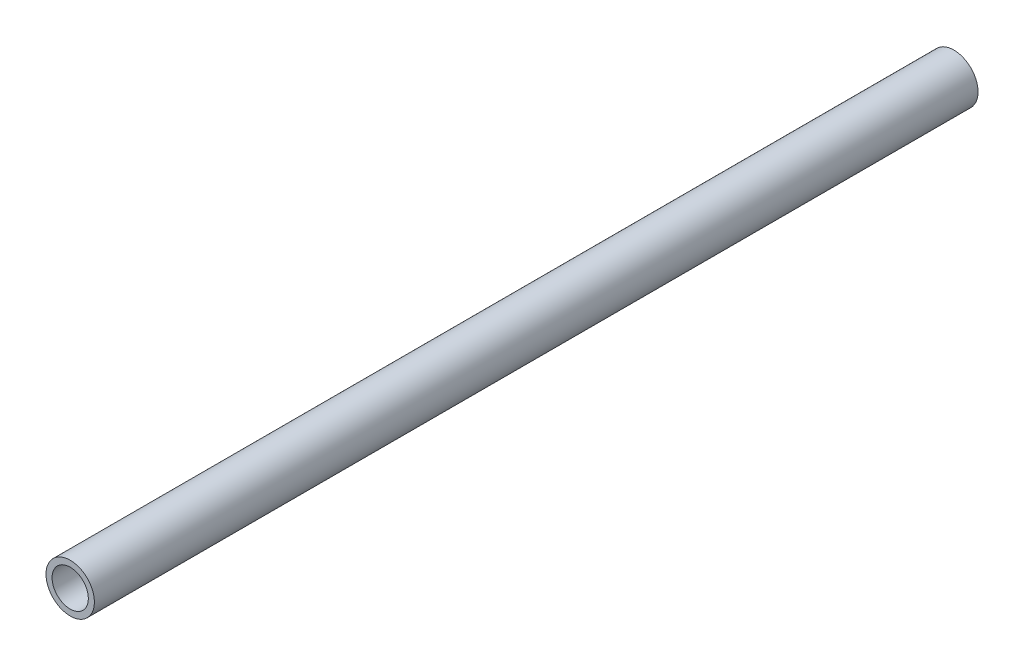
ISO-10303-21;
HEADER;
FILE_DESCRIPTION(('STEP AP214'),'2;1');
FILE_NAME('part.step','',(''),(''),'','','');
FILE_SCHEMA(('AUTOMOTIVE_DESIGN { 1 0 10303 214 1 1 1 1 }'));
ENDSEC;
DATA;
#1=APPLICATION_CONTEXT('core data for automotive mechanical design processes');
#2=APPLICATION_PROTOCOL_DEFINITION('international standard','automotive_design',2000,#1);
#3=PRODUCT_CONTEXT('',#1,'mechanical');
#4=PRODUCT('Part','Part','',(#3));
#5=PRODUCT_RELATED_PRODUCT_CATEGORY('part','',(#4));
#6=PRODUCT_DEFINITION_FORMATION('','',#4);
#7=PRODUCT_DEFINITION_CONTEXT('part definition',#1,'design');
#8=PRODUCT_DEFINITION('design','',#6,#7);
#9=PRODUCT_DEFINITION_SHAPE('','',#8);
#10=(LENGTH_UNIT() NAMED_UNIT(*) SI_UNIT(.MILLI.,.METRE.));
#11=(NAMED_UNIT(*) PLANE_ANGLE_UNIT() SI_UNIT($,.RADIAN.));
#12=(NAMED_UNIT(*) SI_UNIT($,.STERADIAN.) SOLID_ANGLE_UNIT());
#13=UNCERTAINTY_MEASURE_WITH_UNIT(LENGTH_MEASURE(1.E-05),#10,'distance_accuracy_value','');
#14=(GEOMETRIC_REPRESENTATION_CONTEXT(3) GLOBAL_UNCERTAINTY_ASSIGNED_CONTEXT((#13)) GLOBAL_UNIT_ASSIGNED_CONTEXT((#10,
#11,#12)) REPRESENTATION_CONTEXT('',''));
#15=CARTESIAN_POINT('',(0.,0.,0.));
#16=DIRECTION('',(0.,0.,1.));
#17=DIRECTION('',(1.,0.,0.));
#18=AXIS2_PLACEMENT_3D('',#15,#16,#17);
#19=CARTESIAN_POINT('',(0.,0.,232.));
#20=DIRECTION('',(0.,0.,1.));
#21=DIRECTION('',(1.,0.,0.));
#22=AXIS2_PLACEMENT_3D('',#19,#20,#21);
#23=PLANE('',#22);
#24=CARTESIAN_POINT('',(0.,0.,232.));
#25=DIRECTION('',(0.,0.,1.));
#26=DIRECTION('',(1.,0.,0.));
#27=AXIS2_PLACEMENT_3D('',#24,#25,#26);
#28=CIRCLE('',#27,6.35);
#29=CARTESIAN_POINT('',(-6.35,0.,232.));
#30=VERTEX_POINT('',#29);
#31=EDGE_CURVE('E10',#30,#30,#28,.T.);
#32=ORIENTED_EDGE('',*,*,#31,.T.);
#33=EDGE_LOOP('',(#32));
#34=FACE_BOUND('',#33,.T.);
#35=CARTESIAN_POINT('',(0.,0.,232.));
#36=DIRECTION('',(0.,0.,1.));
#37=DIRECTION('',(1.,0.,0.));
#38=AXIS2_PLACEMENT_3D('',#35,#36,#37);
#39=CIRCLE('',#38,4.7625);
#40=CARTESIAN_POINT('',(-4.7625,0.,232.));
#41=VERTEX_POINT('',#40);
#42=EDGE_CURVE('E50',#41,#41,#39,.T.);
#43=ORIENTED_EDGE('',*,*,#42,.F.);
#44=EDGE_LOOP('',(#43));
#45=FACE_BOUND('',#44,.T.);
#46=ADVANCED_FACE('F37',(#34,#45),#23,.T.);
#47=CARTESIAN_POINT('',(0.,0.,0.));
#48=DIRECTION('',(0.,0.,1.));
#49=DIRECTION('',(1.,0.,0.));
#50=AXIS2_PLACEMENT_3D('',#47,#48,#49);
#51=PLANE('',#50);
#52=CARTESIAN_POINT('',(0.,0.,0.));
#53=DIRECTION('',(0.,0.,1.));
#54=DIRECTION('',(1.,0.,0.));
#55=AXIS2_PLACEMENT_3D('',#52,#53,#54);
#56=CIRCLE('',#55,6.35);
#57=CARTESIAN_POINT('',(-6.35,0.,0.));
#58=VERTEX_POINT('',#57);
#59=EDGE_CURVE('E41',#58,#58,#56,.T.);
#60=ORIENTED_EDGE('',*,*,#59,.F.);
#61=EDGE_LOOP('',(#60));
#62=FACE_BOUND('',#61,.T.);
#63=CARTESIAN_POINT('',(0.,0.,0.));
#64=DIRECTION('',(0.,0.,1.));
#65=DIRECTION('',(1.,0.,0.));
#66=AXIS2_PLACEMENT_3D('',#63,#64,#65);
#67=CIRCLE('',#66,4.7625);
#68=CARTESIAN_POINT('',(-4.7625,0.,0.));
#69=VERTEX_POINT('',#68);
#70=EDGE_CURVE('E52',#69,#69,#67,.T.);
#71=ORIENTED_EDGE('',*,*,#70,.T.);
#72=EDGE_LOOP('',(#71));
#73=FACE_BOUND('',#72,.T.);
#74=ADVANCED_FACE('F64',(#62,#73),#51,.F.);
#75=CARTESIAN_POINT('',(0.,0.,232.));
#76=DIRECTION('',(0.,0.,-1.));
#77=DIRECTION('',(-1.,0.,0.));
#78=AXIS2_PLACEMENT_3D('',#75,#76,#77);
#79=CYLINDRICAL_SURFACE('',#78,6.35);
#80=CARTESIAN_POINT('',(-6.35,0.,232.));
#81=CARTESIAN_POINT('',(-6.35,0.,229.583333333333));
#82=CARTESIAN_POINT('',(-6.35,0.,227.166666666667));
#83=CARTESIAN_POINT('',(-6.35,0.,222.333333333333));
#84=CARTESIAN_POINT('',(-6.35,0.,219.916666666667));
#85=CARTESIAN_POINT('',(-6.35,0.,215.083333333333));
#86=CARTESIAN_POINT('',(-6.35,0.,212.666666666667));
#87=CARTESIAN_POINT('',(-6.35,0.,207.833333333333));
#88=CARTESIAN_POINT('',(-6.35,0.,205.416666666667));
#89=CARTESIAN_POINT('',(-6.35,0.,200.583333333333));
#90=CARTESIAN_POINT('',(-6.35,0.,198.166666666667));
#91=CARTESIAN_POINT('',(-6.35,0.,193.333333333333));
#92=CARTESIAN_POINT('',(-6.35,0.,190.916666666667));
#93=CARTESIAN_POINT('',(-6.35,0.,186.083333333333));
#94=CARTESIAN_POINT('',(-6.35,0.,183.666666666667));
#95=CARTESIAN_POINT('',(-6.35,0.,178.833333333333));
#96=CARTESIAN_POINT('',(-6.35,0.,176.416666666667));
#97=CARTESIAN_POINT('',(-6.35,0.,171.583333333333));
#98=CARTESIAN_POINT('',(-6.35,0.,169.166666666667));
#99=CARTESIAN_POINT('',(-6.35,0.,164.333333333333));
#100=CARTESIAN_POINT('',(-6.35,0.,161.916666666667));
#101=CARTESIAN_POINT('',(-6.35,0.,157.083333333333));
#102=CARTESIAN_POINT('',(-6.35,0.,154.666666666667));
#103=CARTESIAN_POINT('',(-6.35,0.,149.833333333333));
#104=CARTESIAN_POINT('',(-6.35,0.,147.416666666667));
#105=CARTESIAN_POINT('',(-6.35,0.,142.583333333333));
#106=CARTESIAN_POINT('',(-6.35,0.,140.166666666667));
#107=CARTESIAN_POINT('',(-6.35,0.,135.333333333333));
#108=CARTESIAN_POINT('',(-6.35,0.,132.916666666667));
#109=CARTESIAN_POINT('',(-6.35,0.,128.083333333333));
#110=CARTESIAN_POINT('',(-6.35,0.,125.666666666667));
#111=CARTESIAN_POINT('',(-6.35,0.,120.833333333333));
#112=CARTESIAN_POINT('',(-6.35,0.,118.416666666667));
#113=CARTESIAN_POINT('',(-6.35,0.,113.583333333333));
#114=CARTESIAN_POINT('',(-6.35,0.,111.166666666667));
#115=CARTESIAN_POINT('',(-6.35,0.,106.333333333333));
#116=CARTESIAN_POINT('',(-6.35,0.,103.916666666667));
#117=CARTESIAN_POINT('',(-6.35,0.,99.0833333333333));
#118=CARTESIAN_POINT('',(-6.35,0.,96.6666666666667));
#119=CARTESIAN_POINT('',(-6.35,0.,91.8333333333334));
#120=CARTESIAN_POINT('',(-6.35,0.,89.4166666666667));
#121=CARTESIAN_POINT('',(-6.35,0.,84.5833333333334));
#122=CARTESIAN_POINT('',(-6.35,0.,82.1666666666667));
#123=CARTESIAN_POINT('',(-6.35,0.,77.3333333333334));
#124=CARTESIAN_POINT('',(-6.35,0.,74.9166666666667));
#125=CARTESIAN_POINT('',(-6.35,0.,70.0833333333333));
#126=CARTESIAN_POINT('',(-6.35,0.,67.6666666666667));
#127=CARTESIAN_POINT('',(-6.35,0.,62.8333333333333));
#128=CARTESIAN_POINT('',(-6.35,0.,60.4166666666667));
#129=CARTESIAN_POINT('',(-6.35,0.,55.5833333333333));
#130=CARTESIAN_POINT('',(-6.35,0.,53.1666666666667));
#131=CARTESIAN_POINT('',(-6.35,0.,48.3333333333333));
#132=CARTESIAN_POINT('',(-6.35,0.,45.9166666666667));
#133=CARTESIAN_POINT('',(-6.35,0.,41.0833333333333));
#134=CARTESIAN_POINT('',(-6.35,0.,38.6666666666667));
#135=CARTESIAN_POINT('',(-6.35,0.,33.8333333333333));
#136=CARTESIAN_POINT('',(-6.35,0.,31.4166666666667));
#137=CARTESIAN_POINT('',(-6.35,0.,26.5833333333333));
#138=CARTESIAN_POINT('',(-6.35,0.,24.1666666666667));
#139=CARTESIAN_POINT('',(-6.35,0.,19.3333333333333));
#140=CARTESIAN_POINT('',(-6.35,0.,16.9166666666667));
#141=CARTESIAN_POINT('',(-6.35,0.,12.0833333333333));
#142=CARTESIAN_POINT('',(-6.35,0.,9.66666666666668));
#143=CARTESIAN_POINT('',(-6.35,0.,4.83333333333334));
#144=CARTESIAN_POINT('',(-6.35,0.,2.41666666666666));
#145=CARTESIAN_POINT('',(-6.35,0.,0.));
#146=B_SPLINE_CURVE_WITH_KNOTS('',3,(#80,#81,#82,#83,#84,#85,#86,#87,#88,#89,#90,#91,#92,#93,
#94,#95,#96,#97,#98,#99,#100,#101,#102,#103,#104,#105,#106,#107,#108,#109,#110,#111,#112,#113,
#114,#115,#116,#117,#118,#119,#120,#121,#122,#123,#124,#125,#126,#127,#128,#129,#130,#131,#132,
#133,#134,#135,#136,#137,#138,#139,#140,#141,#142,#143,#144,#145),.UNSPECIFIED.,.F.,.F.,(4,2,2,
2,2,2,2,2,2,2,2,2,2,2,2,2,2,2,2,2,2,2,2,2,2,2,2,2,2,2,2,2,4),(0.,7.25000000000001,14.5,21.75,
29.,36.25,43.5,50.75,58.,65.25,72.5,79.75,87.,94.25,101.5,108.75,116.,123.25,130.5,137.75,145.,
152.25,159.5,166.75,174.,181.25,188.5,195.75,203.,210.25,217.5,224.75,232.),.UNSPECIFIED.);
#147=EDGE_CURVE('BSEAM39',#30,#58,#146,.T.);
#148=ORIENTED_EDGE('',*,*,#31,.F.);
#149=ORIENTED_EDGE('',*,*,#59,.T.);
#150=ORIENTED_EDGE('',*,*,#147,.T.);
#151=ORIENTED_EDGE('',*,*,#147,.F.);
#152=EDGE_LOOP('',(#148,#150,#149,#151));
#153=FACE_BOUND('',#152,.T.);
#154=ADVANCED_FACE('F39',(#153),#79,.T.);
#155=CARTESIAN_POINT('',(0.,0.,232.));
#156=DIRECTION('',(0.,0.,-1.));
#157=DIRECTION('',(-1.,0.,0.));
#158=AXIS2_PLACEMENT_3D('',#155,#156,#157);
#159=CYLINDRICAL_SURFACE('',#158,4.7625);
#160=CARTESIAN_POINT('',(-4.7625,0.,232.));
#161=CARTESIAN_POINT('',(-4.7625,0.,229.583333333333));
#162=CARTESIAN_POINT('',(-4.7625,0.,227.166666666667));
#163=CARTESIAN_POINT('',(-4.7625,0.,222.333333333333));
#164=CARTESIAN_POINT('',(-4.7625,0.,219.916666666667));
#165=CARTESIAN_POINT('',(-4.7625,0.,215.083333333333));
#166=CARTESIAN_POINT('',(-4.7625,0.,212.666666666667));
#167=CARTESIAN_POINT('',(-4.7625,0.,207.833333333333));
#168=CARTESIAN_POINT('',(-4.7625,0.,205.416666666667));
#169=CARTESIAN_POINT('',(-4.7625,0.,200.583333333333));
#170=CARTESIAN_POINT('',(-4.7625,0.,198.166666666667));
#171=CARTESIAN_POINT('',(-4.7625,0.,193.333333333333));
#172=CARTESIAN_POINT('',(-4.7625,0.,190.916666666667));
#173=CARTESIAN_POINT('',(-4.7625,0.,186.083333333333));
#174=CARTESIAN_POINT('',(-4.7625,0.,183.666666666667));
#175=CARTESIAN_POINT('',(-4.7625,0.,178.833333333333));
#176=CARTESIAN_POINT('',(-4.7625,0.,176.416666666667));
#177=CARTESIAN_POINT('',(-4.7625,0.,171.583333333333));
#178=CARTESIAN_POINT('',(-4.7625,0.,169.166666666667));
#179=CARTESIAN_POINT('',(-4.7625,0.,164.333333333333));
#180=CARTESIAN_POINT('',(-4.7625,0.,161.916666666667));
#181=CARTESIAN_POINT('',(-4.7625,0.,157.083333333333));
#182=CARTESIAN_POINT('',(-4.7625,0.,154.666666666667));
#183=CARTESIAN_POINT('',(-4.7625,0.,149.833333333333));
#184=CARTESIAN_POINT('',(-4.7625,0.,147.416666666667));
#185=CARTESIAN_POINT('',(-4.7625,0.,142.583333333333));
#186=CARTESIAN_POINT('',(-4.7625,0.,140.166666666667));
#187=CARTESIAN_POINT('',(-4.7625,0.,135.333333333333));
#188=CARTESIAN_POINT('',(-4.7625,0.,132.916666666667));
#189=CARTESIAN_POINT('',(-4.7625,0.,128.083333333333));
#190=CARTESIAN_POINT('',(-4.7625,0.,125.666666666667));
#191=CARTESIAN_POINT('',(-4.7625,0.,120.833333333333));
#192=CARTESIAN_POINT('',(-4.7625,0.,118.416666666667));
#193=CARTESIAN_POINT('',(-4.7625,0.,113.583333333333));
#194=CARTESIAN_POINT('',(-4.7625,0.,111.166666666667));
#195=CARTESIAN_POINT('',(-4.7625,0.,106.333333333333));
#196=CARTESIAN_POINT('',(-4.7625,0.,103.916666666667));
#197=CARTESIAN_POINT('',(-4.7625,0.,99.0833333333333));
#198=CARTESIAN_POINT('',(-4.7625,0.,96.6666666666667));
#199=CARTESIAN_POINT('',(-4.7625,0.,91.8333333333333));
#200=CARTESIAN_POINT('',(-4.7625,0.,89.4166666666667));
#201=CARTESIAN_POINT('',(-4.7625,0.,84.5833333333333));
#202=CARTESIAN_POINT('',(-4.7625,0.,82.1666666666667));
#203=CARTESIAN_POINT('',(-4.7625,0.,77.3333333333334));
#204=CARTESIAN_POINT('',(-4.7625,0.,74.9166666666667));
#205=CARTESIAN_POINT('',(-4.7625,0.,70.0833333333333));
#206=CARTESIAN_POINT('',(-4.7625,0.,67.6666666666667));
#207=CARTESIAN_POINT('',(-4.7625,0.,62.8333333333333));
#208=CARTESIAN_POINT('',(-4.7625,0.,60.4166666666667));
#209=CARTESIAN_POINT('',(-4.7625,0.,55.5833333333333));
#210=CARTESIAN_POINT('',(-4.7625,0.,53.1666666666667));
#211=CARTESIAN_POINT('',(-4.7625,0.,48.3333333333333));
#212=CARTESIAN_POINT('',(-4.7625,0.,45.9166666666667));
#213=CARTESIAN_POINT('',(-4.7625,0.,41.0833333333333));
#214=CARTESIAN_POINT('',(-4.7625,0.,38.6666666666667));
#215=CARTESIAN_POINT('',(-4.7625,0.,33.8333333333333));
#216=CARTESIAN_POINT('',(-4.7625,0.,31.4166666666667));
#217=CARTESIAN_POINT('',(-4.7625,0.,26.5833333333333));
#218=CARTESIAN_POINT('',(-4.7625,0.,24.1666666666667));
#219=CARTESIAN_POINT('',(-4.7625,0.,19.3333333333333));
#220=CARTESIAN_POINT('',(-4.7625,0.,16.9166666666667));
#221=CARTESIAN_POINT('',(-4.7625,0.,12.0833333333333));
#222=CARTESIAN_POINT('',(-4.7625,0.,9.66666666666668));
#223=CARTESIAN_POINT('',(-4.7625,0.,4.83333333333334));
#224=CARTESIAN_POINT('',(-4.7625,0.,2.41666666666666));
#225=CARTESIAN_POINT('',(-4.7625,0.,0.));
#226=B_SPLINE_CURVE_WITH_KNOTS('',3,(#160,#161,#162,#163,#164,#165,#166,#167,#168,#169,#170,
#171,#172,#173,#174,#175,#176,#177,#178,#179,#180,#181,#182,#183,#184,#185,#186,#187,#188,#189,
#190,#191,#192,#193,#194,#195,#196,#197,#198,#199,#200,#201,#202,#203,#204,#205,#206,#207,#208,
#209,#210,#211,#212,#213,#214,#215,#216,#217,#218,#219,#220,#221,#222,#223,#224,#225),
.UNSPECIFIED.,.F.,.F.,(4,2,2,2,2,2,2,2,2,2,2,2,2,2,2,2,2,2,2,2,2,2,2,2,2,2,2,2,2,2,2,2,4),(0.,
7.24999999999998,14.5,21.75,29.,36.25,43.5,50.75,58.,65.25,72.5,79.75,87.,94.25,101.5,108.75,
116.,123.25,130.5,137.75,145.,152.25,159.5,166.75,174.,181.25,188.5,195.75,203.,210.25,217.5,
224.75,232.),.UNSPECIFIED.);
#227=EDGE_CURVE('BSEAM60',#41,#69,#226,.T.);
#228=ORIENTED_EDGE('',*,*,#42,.T.);
#229=ORIENTED_EDGE('',*,*,#70,.F.);
#230=ORIENTED_EDGE('',*,*,#227,.T.);
#231=ORIENTED_EDGE('',*,*,#227,.F.);
#232=EDGE_LOOP('',(#228,#230,#229,#231));
#233=FACE_BOUND('',#232,.T.);
#234=ADVANCED_FACE('F60',(#233),#159,.F.);
#235=CLOSED_SHELL('',(#46,#74,#154,#234));
#236=MANIFOLD_SOLID_BREP('B2',#235);
#237=ADVANCED_BREP_SHAPE_REPRESENTATION('',(#18,#236),#14);
#238=SHAPE_DEFINITION_REPRESENTATION(#9,#237);
ENDSEC;
END-ISO-10303-21;
